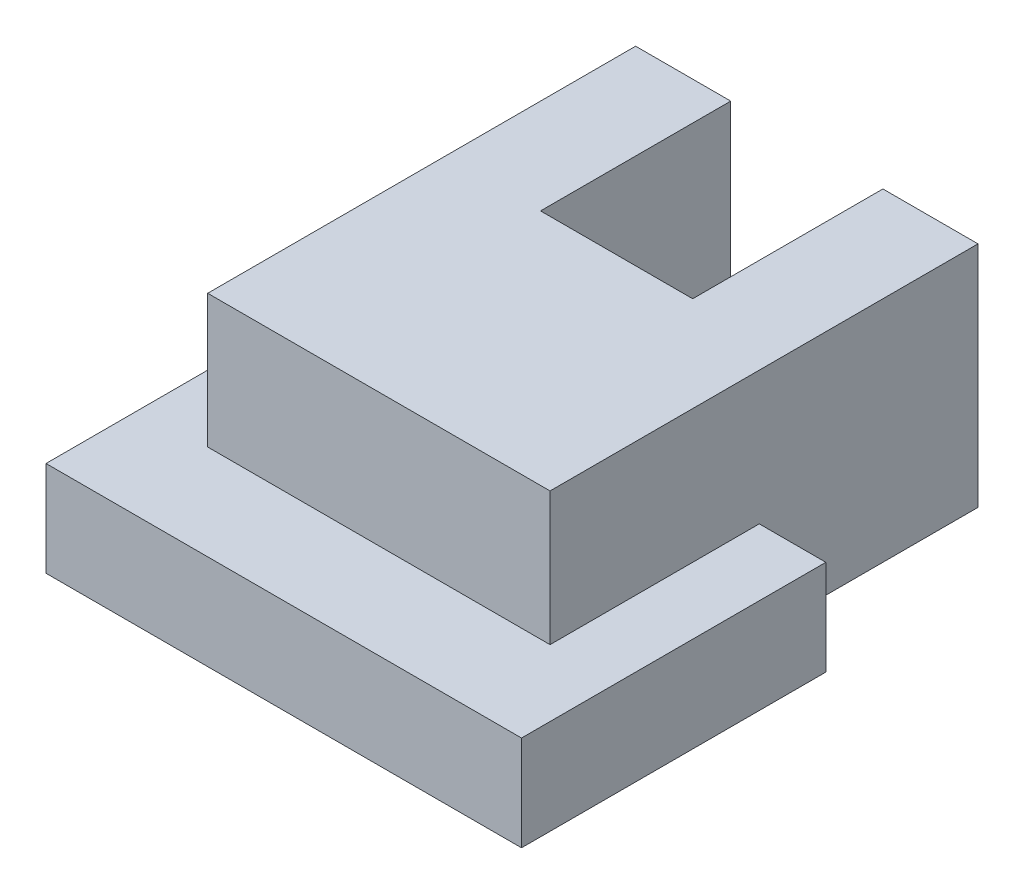
ISO-10303-21;
HEADER;
FILE_DESCRIPTION(('STEP AP214'),'2;1');
FILE_NAME('part.step','',(''),(''),'','','');
FILE_SCHEMA(('AUTOMOTIVE_DESIGN { 1 0 10303 214 1 1 1 1 }'));
ENDSEC;
DATA;
#1=APPLICATION_CONTEXT('core data for automotive mechanical design processes');
#2=APPLICATION_PROTOCOL_DEFINITION('international standard','automotive_design',2000,#1);
#3=PRODUCT_CONTEXT('',#1,'mechanical');
#4=PRODUCT('Part','Part','',(#3));
#5=PRODUCT_RELATED_PRODUCT_CATEGORY('part','',(#4));
#6=PRODUCT_DEFINITION_FORMATION('','',#4);
#7=PRODUCT_DEFINITION_CONTEXT('part definition',#1,'design');
#8=PRODUCT_DEFINITION('design','',#6,#7);
#9=PRODUCT_DEFINITION_SHAPE('','',#8);
#10=(LENGTH_UNIT() NAMED_UNIT(*) SI_UNIT(.MILLI.,.METRE.));
#11=(NAMED_UNIT(*) PLANE_ANGLE_UNIT() SI_UNIT($,.RADIAN.));
#12=(NAMED_UNIT(*) SI_UNIT($,.STERADIAN.) SOLID_ANGLE_UNIT());
#13=UNCERTAINTY_MEASURE_WITH_UNIT(LENGTH_MEASURE(1.E-05),#10,'distance_accuracy_value','');
#14=(GEOMETRIC_REPRESENTATION_CONTEXT(3) GLOBAL_UNCERTAINTY_ASSIGNED_CONTEXT((#13)) GLOBAL_UNIT_ASSIGNED_CONTEXT((#10,
#11,#12)) REPRESENTATION_CONTEXT('',''));
#15=CARTESIAN_POINT('',(0.,0.,0.));
#16=DIRECTION('',(0.,0.,1.));
#17=DIRECTION('',(1.,0.,0.));
#18=AXIS2_PLACEMENT_3D('',#15,#16,#17);
#19=CARTESIAN_POINT('',(-25.,10.,-16.));
#20=DIRECTION('',(0.,0.,1.));
#21=DIRECTION('',(1.,0.,0.));
#22=AXIS2_PLACEMENT_3D('',#19,#20,#21);
#23=PLANE('',#22);
#24=DIRECTION('',(-1.,0.,0.));
#25=VECTOR('',#24,1.);
#26=CARTESIAN_POINT('',(-25.,0.,-16.));
#27=LINE('',#26,#25);
#28=CARTESIAN_POINT('',(25.,0.,-16.));
#29=VERTEX_POINT('',#28);
#30=CARTESIAN_POINT('',(18.,0.,-16.));
#31=VERTEX_POINT('',#30);
#32=EDGE_CURVE('E230',#29,#31,#27,.T.);
#33=ORIENTED_EDGE('',*,*,#32,.T.);
#34=DIRECTION('',(0.,1.,0.));
#35=VECTOR('',#34,1.);
#36=CARTESIAN_POINT('',(18.,10.,-16.));
#37=LINE('',#36,#35);
#38=CARTESIAN_POINT('',(18.,10.,-16.));
#39=VERTEX_POINT('',#38);
#40=EDGE_CURVE('E212',#31,#39,#37,.T.);
#41=ORIENTED_EDGE('',*,*,#40,.T.);
#42=DIRECTION('',(-1.,0.,0.));
#43=VECTOR('',#42,1.);
#44=CARTESIAN_POINT('',(-25.,10.,-16.));
#45=LINE('',#44,#43);
#46=CARTESIAN_POINT('',(25.,10.,-16.));
#47=VERTEX_POINT('',#46);
#48=EDGE_CURVE('E220',#47,#39,#45,.T.);
#49=ORIENTED_EDGE('',*,*,#48,.F.);
#50=DIRECTION('',(0.,-1.,0.));
#51=VECTOR('',#50,1.);
#52=CARTESIAN_POINT('',(25.,10.,-16.));
#53=LINE('',#52,#51);
#54=EDGE_CURVE('E11',#47,#29,#53,.T.);
#55=ORIENTED_EDGE('',*,*,#54,.T.);
#56=EDGE_LOOP('',(#33,#41,#49,#55));
#57=FACE_BOUND('',#56,.T.);
#58=ADVANCED_FACE('F36',(#57),#23,.F.);
#59=CARTESIAN_POINT('',(25.,10.,-16.));
#60=DIRECTION('',(-1.,0.,0.));
#61=DIRECTION('',(0.,0.,1.));
#62=AXIS2_PLACEMENT_3D('',#59,#60,#61);
#63=PLANE('',#62);
#64=DIRECTION('',(0.,0.,-1.));
#65=VECTOR('',#64,1.);
#66=CARTESIAN_POINT('',(25.,0.,-16.));
#67=LINE('',#66,#65);
#68=CARTESIAN_POINT('',(25.,0.,16.));
#69=VERTEX_POINT('',#68);
#70=EDGE_CURVE('E214',#69,#29,#67,.T.);
#71=ORIENTED_EDGE('',*,*,#70,.T.);
#72=ORIENTED_EDGE('',*,*,#54,.F.);
#73=DIRECTION('',(0.,0.,-1.));
#74=VECTOR('',#73,1.);
#75=CARTESIAN_POINT('',(25.,10.,-16.));
#76=LINE('',#75,#74);
#77=CARTESIAN_POINT('',(25.,10.,16.));
#78=VERTEX_POINT('',#77);
#79=EDGE_CURVE('E215',#78,#47,#76,.T.);
#80=ORIENTED_EDGE('',*,*,#79,.F.);
#81=DIRECTION('',(0.,-1.,0.));
#82=VECTOR('',#81,1.);
#83=CARTESIAN_POINT('',(25.,10.,16.));
#84=LINE('',#83,#82);
#85=EDGE_CURVE('E226',#78,#69,#84,.T.);
#86=ORIENTED_EDGE('',*,*,#85,.T.);
#87=EDGE_LOOP('',(#71,#72,#80,#86));
#88=FACE_BOUND('',#87,.T.);
#89=ADVANCED_FACE('F38',(#88),#63,.F.);
#90=CARTESIAN_POINT('',(-18.,10.,-16.));
#91=VERTEX_POINT('',#90);
#92=CARTESIAN_POINT('',(-25.,10.,-16.));
#93=VERTEX_POINT('',#92);
#94=EDGE_CURVE('E218',#91,#93,#45,.T.);
#95=ORIENTED_EDGE('',*,*,#94,.F.);
#96=DIRECTION('',(0.,-1.,0.));
#97=VECTOR('',#96,1.);
#98=CARTESIAN_POINT('',(-18.,10.,-16.));
#99=LINE('',#98,#97);
#100=CARTESIAN_POINT('',(-18.,0.,-16.));
#101=VERTEX_POINT('',#100);
#102=EDGE_CURVE('E207',#91,#101,#99,.T.);
#103=ORIENTED_EDGE('',*,*,#102,.T.);
#104=CARTESIAN_POINT('',(-25.,0.,-16.));
#105=VERTEX_POINT('',#104);
#106=EDGE_CURVE('E229',#101,#105,#27,.T.);
#107=ORIENTED_EDGE('',*,*,#106,.T.);
#108=DIRECTION('',(0.,-1.,0.));
#109=VECTOR('',#108,1.);
#110=CARTESIAN_POINT('',(-25.,10.,-16.));
#111=LINE('',#110,#109);
#112=EDGE_CURVE('E44',#93,#105,#111,.T.);
#113=ORIENTED_EDGE('',*,*,#112,.F.);
#114=EDGE_LOOP('',(#95,#103,#107,#113));
#115=FACE_BOUND('',#114,.T.);
#116=ADVANCED_FACE('F262',(#115),#23,.F.);
#117=CARTESIAN_POINT('',(-25.,10.,-16.));
#118=DIRECTION('',(1.,0.,0.));
#119=DIRECTION('',(0.,0.,-1.));
#120=AXIS2_PLACEMENT_3D('',#117,#118,#119);
#121=PLANE('',#120);
#122=DIRECTION('',(0.,0.,1.));
#123=VECTOR('',#122,1.);
#124=CARTESIAN_POINT('',(-25.,0.,-16.));
#125=LINE('',#124,#123);
#126=CARTESIAN_POINT('',(-25.,0.,16.));
#127=VERTEX_POINT('',#126);
#128=EDGE_CURVE('E232',#105,#127,#125,.T.);
#129=ORIENTED_EDGE('',*,*,#128,.T.);
#130=DIRECTION('',(0.,-1.,0.));
#131=VECTOR('',#130,1.);
#132=CARTESIAN_POINT('',(-25.,10.,16.));
#133=LINE('',#132,#131);
#134=CARTESIAN_POINT('',(-25.,10.,16.));
#135=VERTEX_POINT('',#134);
#136=EDGE_CURVE('E237',#135,#127,#133,.T.);
#137=ORIENTED_EDGE('',*,*,#136,.F.);
#138=DIRECTION('',(0.,0.,1.));
#139=VECTOR('',#138,1.);
#140=CARTESIAN_POINT('',(-25.,10.,-16.));
#141=LINE('',#140,#139);
#142=EDGE_CURVE('E222',#93,#135,#141,.T.);
#143=ORIENTED_EDGE('',*,*,#142,.F.);
#144=ORIENTED_EDGE('',*,*,#112,.T.);
#145=EDGE_LOOP('',(#129,#137,#143,#144));
#146=FACE_BOUND('',#145,.T.);
#147=ADVANCED_FACE('F244',(#146),#121,.F.);
#148=CARTESIAN_POINT('',(-25.,10.,16.));
#149=DIRECTION('',(0.,0.,-1.));
#150=DIRECTION('',(-1.,0.,0.));
#151=AXIS2_PLACEMENT_3D('',#148,#149,#150);
#152=PLANE('',#151);
#153=DIRECTION('',(1.,0.,0.));
#154=VECTOR('',#153,1.);
#155=CARTESIAN_POINT('',(-25.,0.,16.));
#156=LINE('',#155,#154);
#157=EDGE_CURVE('E219',#127,#69,#156,.T.);
#158=ORIENTED_EDGE('',*,*,#157,.T.);
#159=ORIENTED_EDGE('',*,*,#85,.F.);
#160=DIRECTION('',(1.,0.,0.));
#161=VECTOR('',#160,1.);
#162=CARTESIAN_POINT('',(-25.,10.,16.));
#163=LINE('',#162,#161);
#164=EDGE_CURVE('E224',#135,#78,#163,.T.);
#165=ORIENTED_EDGE('',*,*,#164,.F.);
#166=ORIENTED_EDGE('',*,*,#136,.T.);
#167=EDGE_LOOP('',(#158,#159,#165,#166));
#168=FACE_BOUND('',#167,.T.);
#169=ADVANCED_FACE('F255',(#168),#152,.F.);
#170=CARTESIAN_POINT('',(0.,10.,0.));
#171=DIRECTION('',(0.,1.,0.));
#172=DIRECTION('',(0.,0.,1.));
#173=AXIS2_PLACEMENT_3D('',#170,#171,#172);
#174=PLANE('',#173);
#175=DIRECTION('',(0.,0.,-1.));
#176=VECTOR('',#175,1.);
#177=CARTESIAN_POINT('',(18.,10.,0.));
#178=LINE('',#177,#176);
#179=CARTESIAN_POINT('',(18.,10.,6.00000000000001));
#180=VERTEX_POINT('',#179);
#181=EDGE_CURVE('E51',#180,#39,#178,.T.);
#182=ORIENTED_EDGE('',*,*,#181,.F.);
#183=DIRECTION('',(1.,0.,0.));
#184=VECTOR('',#183,1.);
#185=CARTESIAN_POINT('',(0.,10.,6.00000000000001));
#186=LINE('',#185,#184);
#187=CARTESIAN_POINT('',(-18.,10.,6.00000000000001));
#188=VERTEX_POINT('',#187);
#189=EDGE_CURVE('E209',#188,#180,#186,.T.);
#190=ORIENTED_EDGE('',*,*,#189,.F.);
#191=DIRECTION('',(0.,0.,1.));
#192=VECTOR('',#191,1.);
#193=CARTESIAN_POINT('',(-18.,10.,0.));
#194=LINE('',#193,#192);
#195=EDGE_CURVE('E57',#91,#188,#194,.T.);
#196=ORIENTED_EDGE('',*,*,#195,.F.);
#197=ORIENTED_EDGE('',*,*,#94,.T.);
#198=ORIENTED_EDGE('',*,*,#142,.T.);
#199=ORIENTED_EDGE('',*,*,#164,.T.);
#200=ORIENTED_EDGE('',*,*,#79,.T.);
#201=ORIENTED_EDGE('',*,*,#48,.T.);
#202=EDGE_LOOP('',(#182,#190,#196,#197,#198,#199,#200,#201));
#203=FACE_BOUND('',#202,.T.);
#204=ADVANCED_FACE('F260',(#203),#174,.T.);
#205=CARTESIAN_POINT('',(0.,0.,0.));
#206=DIRECTION('',(0.,1.,0.));
#207=DIRECTION('',(0.,0.,1.));
#208=AXIS2_PLACEMENT_3D('',#205,#206,#207);
#209=PLANE('',#208);
#210=ORIENTED_EDGE('',*,*,#106,.F.);
#211=DIRECTION('',(0.,0.,-1.));
#212=VECTOR('',#211,1.);
#213=CARTESIAN_POINT('',(-18.,0.,-39.));
#214=LINE('',#213,#212);
#215=CARTESIAN_POINT('',(-18.,0.,-39.));
#216=VERTEX_POINT('',#215);
#217=EDGE_CURVE('E189',#101,#216,#214,.T.);
#218=ORIENTED_EDGE('',*,*,#217,.T.);
#219=DIRECTION('',(1.,0.,0.));
#220=VECTOR('',#219,1.);
#221=CARTESIAN_POINT('',(-8.,0.,-39.));
#222=LINE('',#221,#220);
#223=CARTESIAN_POINT('',(-8.,0.,-39.));
#224=VERTEX_POINT('',#223);
#225=EDGE_CURVE('E187',#216,#224,#222,.T.);
#226=ORIENTED_EDGE('',*,*,#225,.T.);
#227=DIRECTION('',(0.,0.,1.));
#228=VECTOR('',#227,1.);
#229=CARTESIAN_POINT('',(-8.,0.,-39.));
#230=LINE('',#229,#228);
#231=CARTESIAN_POINT('',(-8.,0.,-19.));
#232=VERTEX_POINT('',#231);
#233=EDGE_CURVE('E185',#224,#232,#230,.T.);
#234=ORIENTED_EDGE('',*,*,#233,.T.);
#235=DIRECTION('',(1.,0.,0.));
#236=VECTOR('',#235,1.);
#237=CARTESIAN_POINT('',(-8.,0.,-19.));
#238=LINE('',#237,#236);
#239=CARTESIAN_POINT('',(8.,0.,-19.));
#240=VERTEX_POINT('',#239);
#241=EDGE_CURVE('E182',#232,#240,#238,.T.);
#242=ORIENTED_EDGE('',*,*,#241,.T.);
#243=DIRECTION('',(0.,0.,-1.));
#244=VECTOR('',#243,1.);
#245=CARTESIAN_POINT('',(8.,0.,-39.));
#246=LINE('',#245,#244);
#247=CARTESIAN_POINT('',(8.,0.,-39.));
#248=VERTEX_POINT('',#247);
#249=EDGE_CURVE('E180',#240,#248,#246,.T.);
#250=ORIENTED_EDGE('',*,*,#249,.T.);
#251=DIRECTION('',(1.,0.,0.));
#252=VECTOR('',#251,1.);
#253=CARTESIAN_POINT('',(18.,0.,-39.));
#254=LINE('',#253,#252);
#255=CARTESIAN_POINT('',(18.,0.,-39.));
#256=VERTEX_POINT('',#255);
#257=EDGE_CURVE('E192',#248,#256,#254,.T.);
#258=ORIENTED_EDGE('',*,*,#257,.T.);
#259=DIRECTION('',(0.,0.,1.));
#260=VECTOR('',#259,1.);
#261=CARTESIAN_POINT('',(18.,0.,-39.));
#262=LINE('',#261,#260);
#263=EDGE_CURVE('E146',#256,#31,#262,.T.);
#264=ORIENTED_EDGE('',*,*,#263,.T.);
#265=ORIENTED_EDGE('',*,*,#32,.F.);
#266=ORIENTED_EDGE('',*,*,#70,.F.);
#267=ORIENTED_EDGE('',*,*,#157,.F.);
#268=ORIENTED_EDGE('',*,*,#128,.F.);
#269=EDGE_LOOP('',(#210,#218,#226,#234,#242,#250,#258,#264,#265,#266,#267,#268));
#270=FACE_BOUND('',#269,.T.);
#271=ADVANCED_FACE('F250',(#270),#209,.F.);
#272=CARTESIAN_POINT('',(18.,-57.6281181368956,-39.));
#273=DIRECTION('',(1.,0.,0.));
#274=DIRECTION('',(0.,0.,-1.));
#275=AXIS2_PLACEMENT_3D('',#272,#273,#274);
#276=PLANE('',#275);
#277=ORIENTED_EDGE('',*,*,#40,.F.);
#278=ORIENTED_EDGE('',*,*,#263,.F.);
#279=DIRECTION('',(0.,1.,0.));
#280=VECTOR('',#279,1.);
#281=CARTESIAN_POINT('',(18.,-57.6281181368956,-39.));
#282=LINE('',#281,#280);
#283=CARTESIAN_POINT('',(18.,24.,-39.));
#284=VERTEX_POINT('',#283);
#285=EDGE_CURVE('E138',#256,#284,#282,.T.);
#286=ORIENTED_EDGE('',*,*,#285,.T.);
#287=DIRECTION('',(0.,0.,-1.));
#288=VECTOR('',#287,1.);
#289=CARTESIAN_POINT('',(18.,24.,-39.));
#290=LINE('',#289,#288);
#291=CARTESIAN_POINT('',(18.,24.,6.00000000000001));
#292=VERTEX_POINT('',#291);
#293=EDGE_CURVE('E144',#292,#284,#290,.T.);
#294=ORIENTED_EDGE('',*,*,#293,.F.);
#295=DIRECTION('',(0.,1.,0.));
#296=VECTOR('',#295,1.);
#297=CARTESIAN_POINT('',(18.,-57.6281181368956,6.00000000000001));
#298=LINE('',#297,#296);
#299=EDGE_CURVE('E183',#180,#292,#298,.T.);
#300=ORIENTED_EDGE('',*,*,#299,.F.);
#301=ORIENTED_EDGE('',*,*,#181,.T.);
#302=EDGE_LOOP('',(#277,#278,#286,#294,#300,#301));
#303=FACE_BOUND('',#302,.T.);
#304=ADVANCED_FACE('F141',(#303),#276,.T.);
#305=CARTESIAN_POINT('',(-18.,-57.6281181368956,-39.));
#306=DIRECTION('',(-1.,0.,0.));
#307=DIRECTION('',(0.,0.,1.));
#308=AXIS2_PLACEMENT_3D('',#305,#306,#307);
#309=PLANE('',#308);
#310=ORIENTED_EDGE('',*,*,#102,.F.);
#311=ORIENTED_EDGE('',*,*,#195,.T.);
#312=DIRECTION('',(0.,1.,0.));
#313=VECTOR('',#312,1.);
#314=CARTESIAN_POINT('',(-18.,-57.6281181368956,6.00000000000001));
#315=LINE('',#314,#313);
#316=CARTESIAN_POINT('',(-18.,24.,6.00000000000001));
#317=VERTEX_POINT('',#316);
#318=EDGE_CURVE('E194',#188,#317,#315,.T.);
#319=ORIENTED_EDGE('',*,*,#318,.T.);
#320=DIRECTION('',(0.,0.,1.));
#321=VECTOR('',#320,1.);
#322=CARTESIAN_POINT('',(-18.,24.,-39.));
#323=LINE('',#322,#321);
#324=CARTESIAN_POINT('',(-18.,24.,-39.));
#325=VERTEX_POINT('',#324);
#326=EDGE_CURVE('E177',#325,#317,#323,.T.);
#327=ORIENTED_EDGE('',*,*,#326,.F.);
#328=DIRECTION('',(0.,1.,0.));
#329=VECTOR('',#328,1.);
#330=CARTESIAN_POINT('',(-18.,-57.6281181368956,-39.));
#331=LINE('',#330,#329);
#332=EDGE_CURVE('E196',#216,#325,#331,.T.);
#333=ORIENTED_EDGE('',*,*,#332,.F.);
#334=ORIENTED_EDGE('',*,*,#217,.F.);
#335=EDGE_LOOP('',(#310,#311,#319,#327,#333,#334));
#336=FACE_BOUND('',#335,.T.);
#337=ADVANCED_FACE('F264',(#336),#309,.T.);
#338=CARTESIAN_POINT('',(18.,-57.6281181368956,6.00000000000001));
#339=DIRECTION('',(0.,0.,1.));
#340=DIRECTION('',(1.,0.,0.));
#341=AXIS2_PLACEMENT_3D('',#338,#339,#340);
#342=PLANE('',#341);
#343=ORIENTED_EDGE('',*,*,#318,.F.);
#344=ORIENTED_EDGE('',*,*,#189,.T.);
#345=ORIENTED_EDGE('',*,*,#299,.T.);
#346=DIRECTION('',(1.,0.,0.));
#347=VECTOR('',#346,1.);
#348=CARTESIAN_POINT('',(18.,24.,6.00000000000001));
#349=LINE('',#348,#347);
#350=EDGE_CURVE('E150',#317,#292,#349,.T.);
#351=ORIENTED_EDGE('',*,*,#350,.F.);
#352=EDGE_LOOP('',(#343,#344,#345,#351));
#353=FACE_BOUND('',#352,.T.);
#354=ADVANCED_FACE('F288',(#353),#342,.T.);
#355=CARTESIAN_POINT('',(-8.,-57.6281181368956,-39.));
#356=DIRECTION('',(0.,0.,-1.));
#357=DIRECTION('',(-1.,0.,0.));
#358=AXIS2_PLACEMENT_3D('',#355,#356,#357);
#359=PLANE('',#358);
#360=ORIENTED_EDGE('',*,*,#225,.F.);
#361=ORIENTED_EDGE('',*,*,#332,.T.);
#362=DIRECTION('',(-1.,0.,0.));
#363=VECTOR('',#362,1.);
#364=CARTESIAN_POINT('',(-8.,24.,-39.));
#365=LINE('',#364,#363);
#366=CARTESIAN_POINT('',(-8.,24.,-39.));
#367=VERTEX_POINT('',#366);
#368=EDGE_CURVE('E174',#367,#325,#365,.T.);
#369=ORIENTED_EDGE('',*,*,#368,.F.);
#370=DIRECTION('',(0.,1.,0.));
#371=VECTOR('',#370,1.);
#372=CARTESIAN_POINT('',(-8.,-57.6281181368956,-39.));
#373=LINE('',#372,#371);
#374=EDGE_CURVE('E198',#224,#367,#373,.T.);
#375=ORIENTED_EDGE('',*,*,#374,.F.);
#376=EDGE_LOOP('',(#360,#361,#369,#375));
#377=FACE_BOUND('',#376,.T.);
#378=ADVANCED_FACE('F272',(#377),#359,.T.);
#379=CARTESIAN_POINT('',(-8.,-57.6281181368956,-39.));
#380=DIRECTION('',(1.,0.,0.));
#381=DIRECTION('',(0.,0.,-1.));
#382=AXIS2_PLACEMENT_3D('',#379,#380,#381);
#383=PLANE('',#382);
#384=ORIENTED_EDGE('',*,*,#233,.F.);
#385=ORIENTED_EDGE('',*,*,#374,.T.);
#386=DIRECTION('',(0.,0.,-1.));
#387=VECTOR('',#386,1.);
#388=CARTESIAN_POINT('',(-8.,24.,-39.));
#389=LINE('',#388,#387);
#390=CARTESIAN_POINT('',(-8.,24.,-19.));
#391=VERTEX_POINT('',#390);
#392=EDGE_CURVE('E171',#391,#367,#389,.T.);
#393=ORIENTED_EDGE('',*,*,#392,.F.);
#394=DIRECTION('',(0.,1.,0.));
#395=VECTOR('',#394,1.);
#396=CARTESIAN_POINT('',(-8.,-57.6281181368956,-19.));
#397=LINE('',#396,#395);
#398=EDGE_CURVE('E200',#232,#391,#397,.T.);
#399=ORIENTED_EDGE('',*,*,#398,.F.);
#400=EDGE_LOOP('',(#384,#385,#393,#399));
#401=FACE_BOUND('',#400,.T.);
#402=ADVANCED_FACE('F276',(#401),#383,.T.);
#403=CARTESIAN_POINT('',(-8.,-57.6281181368956,-19.));
#404=DIRECTION('',(0.,0.,-1.));
#405=DIRECTION('',(-1.,0.,0.));
#406=AXIS2_PLACEMENT_3D('',#403,#404,#405);
#407=PLANE('',#406);
#408=ORIENTED_EDGE('',*,*,#241,.F.);
#409=ORIENTED_EDGE('',*,*,#398,.T.);
#410=DIRECTION('',(-1.,0.,0.));
#411=VECTOR('',#410,1.);
#412=CARTESIAN_POINT('',(-8.,24.,-19.));
#413=LINE('',#412,#411);
#414=CARTESIAN_POINT('',(8.,24.,-19.));
#415=VERTEX_POINT('',#414);
#416=EDGE_CURVE('E168',#415,#391,#413,.T.);
#417=ORIENTED_EDGE('',*,*,#416,.F.);
#418=DIRECTION('',(0.,1.,0.));
#419=VECTOR('',#418,1.);
#420=CARTESIAN_POINT('',(8.,-57.6281181368956,-19.));
#421=LINE('',#420,#419);
#422=EDGE_CURVE('E202',#240,#415,#421,.T.);
#423=ORIENTED_EDGE('',*,*,#422,.F.);
#424=EDGE_LOOP('',(#408,#409,#417,#423));
#425=FACE_BOUND('',#424,.T.);
#426=ADVANCED_FACE('F282',(#425),#407,.T.);
#427=CARTESIAN_POINT('',(8.,-57.6281181368956,-39.));
#428=DIRECTION('',(-1.,0.,0.));
#429=DIRECTION('',(0.,0.,1.));
#430=AXIS2_PLACEMENT_3D('',#427,#428,#429);
#431=PLANE('',#430);
#432=ORIENTED_EDGE('',*,*,#249,.F.);
#433=ORIENTED_EDGE('',*,*,#422,.T.);
#434=DIRECTION('',(0.,0.,1.));
#435=VECTOR('',#434,1.);
#436=CARTESIAN_POINT('',(8.,24.,-39.));
#437=LINE('',#436,#435);
#438=CARTESIAN_POINT('',(8.,24.,-39.));
#439=VERTEX_POINT('',#438);
#440=EDGE_CURVE('E159',#439,#415,#437,.T.);
#441=ORIENTED_EDGE('',*,*,#440,.F.);
#442=DIRECTION('',(0.,1.,0.));
#443=VECTOR('',#442,1.);
#444=CARTESIAN_POINT('',(8.,-57.6281181368956,-39.));
#445=LINE('',#444,#443);
#446=EDGE_CURVE('E149',#248,#439,#445,.T.);
#447=ORIENTED_EDGE('',*,*,#446,.F.);
#448=EDGE_LOOP('',(#432,#433,#441,#447));
#449=FACE_BOUND('',#448,.T.);
#450=ADVANCED_FACE('F285',(#449),#431,.T.);
#451=CARTESIAN_POINT('',(18.,-57.6281181368956,-39.));
#452=DIRECTION('',(0.,0.,-1.));
#453=DIRECTION('',(-1.,0.,0.));
#454=AXIS2_PLACEMENT_3D('',#451,#452,#453);
#455=PLANE('',#454);
#456=ORIENTED_EDGE('',*,*,#257,.F.);
#457=ORIENTED_EDGE('',*,*,#446,.T.);
#458=DIRECTION('',(-1.,0.,0.));
#459=VECTOR('',#458,1.);
#460=CARTESIAN_POINT('',(18.,24.,-39.));
#461=LINE('',#460,#459);
#462=EDGE_CURVE('E153',#284,#439,#461,.T.);
#463=ORIENTED_EDGE('',*,*,#462,.F.);
#464=ORIENTED_EDGE('',*,*,#285,.F.);
#465=EDGE_LOOP('',(#456,#457,#463,#464));
#466=FACE_BOUND('',#465,.T.);
#467=ADVANCED_FACE('F154',(#466),#455,.T.);
#468=CARTESIAN_POINT('',(0.,24.,0.));
#469=DIRECTION('',(0.,-1.,0.));
#470=DIRECTION('',(0.,0.,-1.));
#471=AXIS2_PLACEMENT_3D('',#468,#469,#470);
#472=PLANE('',#471);
#473=ORIENTED_EDGE('',*,*,#293,.T.);
#474=ORIENTED_EDGE('',*,*,#462,.T.);
#475=ORIENTED_EDGE('',*,*,#440,.T.);
#476=ORIENTED_EDGE('',*,*,#416,.T.);
#477=ORIENTED_EDGE('',*,*,#392,.T.);
#478=ORIENTED_EDGE('',*,*,#368,.T.);
#479=ORIENTED_EDGE('',*,*,#326,.T.);
#480=ORIENTED_EDGE('',*,*,#350,.T.);
#481=EDGE_LOOP('',(#473,#474,#475,#476,#477,#478,#479,#480));
#482=FACE_BOUND('',#481,.T.);
#483=ADVANCED_FACE('F162',(#482),#472,.F.);
#484=CLOSED_SHELL('',(#58,#89,#116,#147,#169,#204,#271,#304,#337,#354,#378,#402,#426,#450,#467,#483));
#485=MANIFOLD_SOLID_BREP('B2',#484);
#486=ADVANCED_BREP_SHAPE_REPRESENTATION('',(#18,#485),#14);
#487=SHAPE_DEFINITION_REPRESENTATION(#9,#486);
ENDSEC;
END-ISO-10303-21;
